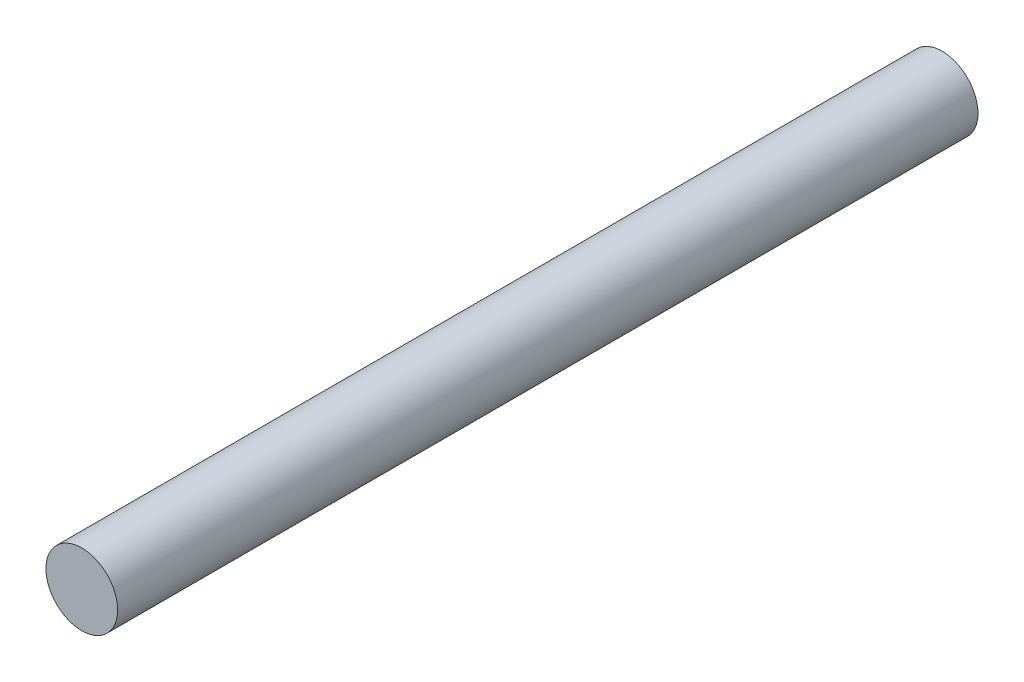
ISO-10303-21;
HEADER;
FILE_DESCRIPTION(('STEP AP214'),'2;1');
FILE_NAME('part.step','',(''),(''),'','','');
FILE_SCHEMA(('AUTOMOTIVE_DESIGN { 1 0 10303 214 1 1 1 1 }'));
ENDSEC;
DATA;
#1=APPLICATION_CONTEXT('core data for automotive mechanical design processes');
#2=APPLICATION_PROTOCOL_DEFINITION('international standard','automotive_design',2000,#1);
#3=PRODUCT_CONTEXT('',#1,'mechanical');
#4=PRODUCT('Part','Part','',(#3));
#5=PRODUCT_RELATED_PRODUCT_CATEGORY('part','',(#4));
#6=PRODUCT_DEFINITION_FORMATION('','',#4);
#7=PRODUCT_DEFINITION_CONTEXT('part definition',#1,'design');
#8=PRODUCT_DEFINITION('design','',#6,#7);
#9=PRODUCT_DEFINITION_SHAPE('','',#8);
#10=(LENGTH_UNIT() NAMED_UNIT(*) SI_UNIT(.MILLI.,.METRE.));
#11=(NAMED_UNIT(*) PLANE_ANGLE_UNIT() SI_UNIT($,.RADIAN.));
#12=(NAMED_UNIT(*) SI_UNIT($,.STERADIAN.) SOLID_ANGLE_UNIT());
#13=UNCERTAINTY_MEASURE_WITH_UNIT(LENGTH_MEASURE(1.E-05),#10,'distance_accuracy_value','');
#14=(GEOMETRIC_REPRESENTATION_CONTEXT(3) GLOBAL_UNCERTAINTY_ASSIGNED_CONTEXT((#13)) GLOBAL_UNIT_ASSIGNED_CONTEXT((#10,
#11,#12)) REPRESENTATION_CONTEXT('',''));
#15=CARTESIAN_POINT('',(0.,0.,0.));
#16=DIRECTION('',(0.,0.,1.));
#17=DIRECTION('',(1.,0.,0.));
#18=AXIS2_PLACEMENT_3D('',#15,#16,#17);
#19=CARTESIAN_POINT('',(0.,0.,72.));
#20=DIRECTION('',(0.,0.,-1.));
#21=DIRECTION('',(-1.,0.,0.));
#22=AXIS2_PLACEMENT_3D('',#19,#20,#21);
#23=CYLINDRICAL_SURFACE('',#22,3.);
#24=CARTESIAN_POINT('',(0.,0.,72.));
#25=DIRECTION('',(0.,0.,1.));
#26=DIRECTION('',(1.,0.,0.));
#27=AXIS2_PLACEMENT_3D('',#24,#25,#26);
#28=CIRCLE('',#27,3.);
#29=CARTESIAN_POINT('',(3.,0.,72.));
#30=VERTEX_POINT('',#29);
#31=EDGE_CURVE('E10',#30,#30,#28,.T.);
#32=ORIENTED_EDGE('',*,*,#31,.F.);
#33=EDGE_LOOP('',(#32));
#34=FACE_BOUND('',#33,.T.);
#35=CARTESIAN_POINT('',(0.,0.,0.));
#36=DIRECTION('',(0.,0.,1.));
#37=DIRECTION('',(1.,0.,0.));
#38=AXIS2_PLACEMENT_3D('',#35,#36,#37);
#39=CIRCLE('',#38,3.);
#40=CARTESIAN_POINT('',(3.,0.,0.));
#41=VERTEX_POINT('',#40);
#42=EDGE_CURVE('E46',#41,#41,#39,.T.);
#43=ORIENTED_EDGE('',*,*,#42,.T.);
#44=EDGE_LOOP('',(#43));
#45=FACE_BOUND('',#44,.T.);
#46=ADVANCED_FACE('F43',(#34,#45),#23,.T.);
#47=CARTESIAN_POINT('',(0.,0.,72.));
#48=DIRECTION('',(0.,0.,1.));
#49=DIRECTION('',(1.,0.,0.));
#50=AXIS2_PLACEMENT_3D('',#47,#48,#49);
#51=PLANE('',#50);
#52=ORIENTED_EDGE('',*,*,#31,.T.);
#53=EDGE_LOOP('',(#52));
#54=FACE_BOUND('',#53,.T.);
#55=ADVANCED_FACE('F60',(#54),#51,.T.);
#56=CARTESIAN_POINT('',(0.,0.,0.));
#57=DIRECTION('',(0.,0.,1.));
#58=DIRECTION('',(1.,0.,0.));
#59=AXIS2_PLACEMENT_3D('',#56,#57,#58);
#60=PLANE('',#59);
#61=ORIENTED_EDGE('',*,*,#42,.F.);
#62=EDGE_LOOP('',(#61));
#63=FACE_BOUND('',#62,.T.);
#64=ADVANCED_FACE('F58',(#63),#60,.F.);
#65=CLOSED_SHELL('',(#46,#55,#64));
#66=MANIFOLD_SOLID_BREP('B2',#65);
#67=ADVANCED_BREP_SHAPE_REPRESENTATION('',(#18,#66),#14);
#68=SHAPE_DEFINITION_REPRESENTATION(#9,#67);
ENDSEC;
END-ISO-10303-21;
